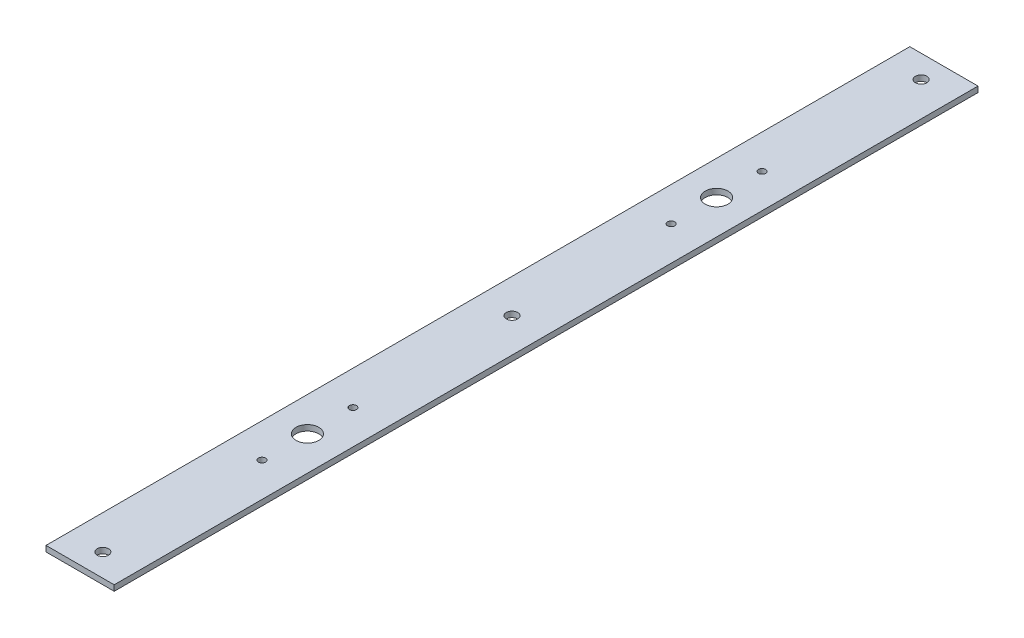
ISO-10303-21;
HEADER;
FILE_DESCRIPTION(('STEP AP214'),'2;1');
FILE_NAME('part.step','',(''),(''),'','','');
FILE_SCHEMA(('AUTOMOTIVE_DESIGN { 1 0 10303 214 1 1 1 1 }'));
ENDSEC;
DATA;
#1=APPLICATION_CONTEXT('core data for automotive mechanical design processes');
#2=APPLICATION_PROTOCOL_DEFINITION('international standard','automotive_design',2000,#1);
#3=PRODUCT_CONTEXT('',#1,'mechanical');
#4=PRODUCT('Part','Part','',(#3));
#5=PRODUCT_RELATED_PRODUCT_CATEGORY('part','',(#4));
#6=PRODUCT_DEFINITION_FORMATION('','',#4);
#7=PRODUCT_DEFINITION_CONTEXT('part definition',#1,'design');
#8=PRODUCT_DEFINITION('design','',#6,#7);
#9=PRODUCT_DEFINITION_SHAPE('','',#8);
#10=(LENGTH_UNIT() NAMED_UNIT(*) SI_UNIT(.MILLI.,.METRE.));
#11=(NAMED_UNIT(*) PLANE_ANGLE_UNIT() SI_UNIT($,.RADIAN.));
#12=(NAMED_UNIT(*) SI_UNIT($,.STERADIAN.) SOLID_ANGLE_UNIT());
#13=UNCERTAINTY_MEASURE_WITH_UNIT(LENGTH_MEASURE(1.E-05),#10,'distance_accuracy_value','');
#14=(GEOMETRIC_REPRESENTATION_CONTEXT(3) GLOBAL_UNCERTAINTY_ASSIGNED_CONTEXT((#13)) GLOBAL_UNIT_ASSIGNED_CONTEXT((#10,
#11,#12)) REPRESENTATION_CONTEXT('',''));
#15=CARTESIAN_POINT('',(0.,0.,0.));
#16=DIRECTION('',(0.,0.,1.));
#17=DIRECTION('',(1.,0.,0.));
#18=AXIS2_PLACEMENT_3D('',#15,#16,#17);
#19=CARTESIAN_POINT('',(19.05,3.175,-241.3));
#20=DIRECTION('',(-1.,0.,0.));
#21=DIRECTION('',(0.,0.,1.));
#22=AXIS2_PLACEMENT_3D('',#19,#20,#21);
#23=PLANE('',#22);
#24=DIRECTION('',(0.,0.,-1.));
#25=VECTOR('',#24,1.);
#26=CARTESIAN_POINT('',(19.05,0.,-241.3));
#27=LINE('',#26,#25);
#28=CARTESIAN_POINT('',(19.05,0.,241.3));
#29=VERTEX_POINT('',#28);
#30=CARTESIAN_POINT('',(19.05,0.,-241.3));
#31=VERTEX_POINT('',#30);
#32=EDGE_CURVE('E95',#29,#31,#27,.T.);
#33=ORIENTED_EDGE('',*,*,#32,.T.);
#34=DIRECTION('',(0.,-1.,0.));
#35=VECTOR('',#34,1.);
#36=CARTESIAN_POINT('',(19.05,3.175,-241.3));
#37=LINE('',#36,#35);
#38=CARTESIAN_POINT('',(19.05,3.175,-241.3));
#39=VERTEX_POINT('',#38);
#40=EDGE_CURVE('E11',#39,#31,#37,.T.);
#41=ORIENTED_EDGE('',*,*,#40,.F.);
#42=DIRECTION('',(0.,0.,-1.));
#43=VECTOR('',#42,1.);
#44=CARTESIAN_POINT('',(19.05,3.175,-241.3));
#45=LINE('',#44,#43);
#46=CARTESIAN_POINT('',(19.05,3.175,241.3));
#47=VERTEX_POINT('',#46);
#48=EDGE_CURVE('E83',#47,#39,#45,.T.);
#49=ORIENTED_EDGE('',*,*,#48,.F.);
#50=DIRECTION('',(0.,-1.,0.));
#51=VECTOR('',#50,1.);
#52=CARTESIAN_POINT('',(19.05,3.175,241.3));
#53=LINE('',#52,#51);
#54=EDGE_CURVE('E91',#47,#29,#53,.T.);
#55=ORIENTED_EDGE('',*,*,#54,.T.);
#56=EDGE_LOOP('',(#33,#41,#49,#55));
#57=FACE_BOUND('',#56,.T.);
#58=ADVANCED_FACE('F32',(#57),#23,.F.);
#59=CARTESIAN_POINT('',(-19.05,3.175,-241.3));
#60=DIRECTION('',(0.,0.,1.));
#61=DIRECTION('',(1.,0.,0.));
#62=AXIS2_PLACEMENT_3D('',#59,#60,#61);
#63=PLANE('',#62);
#64=DIRECTION('',(-1.,0.,0.));
#65=VECTOR('',#64,1.);
#66=CARTESIAN_POINT('',(-19.05,0.,-241.3));
#67=LINE('',#66,#65);
#68=CARTESIAN_POINT('',(-19.05,0.,-241.3));
#69=VERTEX_POINT('',#68);
#70=EDGE_CURVE('E87',#31,#69,#67,.T.);
#71=ORIENTED_EDGE('',*,*,#70,.T.);
#72=DIRECTION('',(0.,-1.,0.));
#73=VECTOR('',#72,1.);
#74=CARTESIAN_POINT('',(-19.05,3.175,-241.3));
#75=LINE('',#74,#73);
#76=CARTESIAN_POINT('',(-19.05,3.175,-241.3));
#77=VERTEX_POINT('',#76);
#78=EDGE_CURVE('E40',#77,#69,#75,.T.);
#79=ORIENTED_EDGE('',*,*,#78,.F.);
#80=DIRECTION('',(-1.,0.,0.));
#81=VECTOR('',#80,1.);
#82=CARTESIAN_POINT('',(-19.05,3.175,-241.3));
#83=LINE('',#82,#81);
#84=EDGE_CURVE('E78',#39,#77,#83,.T.);
#85=ORIENTED_EDGE('',*,*,#84,.F.);
#86=ORIENTED_EDGE('',*,*,#40,.T.);
#87=EDGE_LOOP('',(#71,#79,#85,#86));
#88=FACE_BOUND('',#87,.T.);
#89=ADVANCED_FACE('F86',(#88),#63,.F.);
#90=CARTESIAN_POINT('',(-19.05,3.175,241.3));
#91=DIRECTION('',(1.,0.,0.));
#92=DIRECTION('',(0.,0.,-1.));
#93=AXIS2_PLACEMENT_3D('',#90,#91,#92);
#94=PLANE('',#93);
#95=DIRECTION('',(0.,0.,1.));
#96=VECTOR('',#95,1.);
#97=CARTESIAN_POINT('',(-19.05,0.,241.3));
#98=LINE('',#97,#96);
#99=CARTESIAN_POINT('',(-19.05,0.,241.3));
#100=VERTEX_POINT('',#99);
#101=EDGE_CURVE('E65',#69,#100,#98,.T.);
#102=ORIENTED_EDGE('',*,*,#101,.T.);
#103=DIRECTION('',(0.,-1.,0.));
#104=VECTOR('',#103,1.);
#105=CARTESIAN_POINT('',(-19.05,3.175,241.3));
#106=LINE('',#105,#104);
#107=CARTESIAN_POINT('',(-19.05,3.175,241.3));
#108=VERTEX_POINT('',#107);
#109=EDGE_CURVE('E88',#108,#100,#106,.T.);
#110=ORIENTED_EDGE('',*,*,#109,.F.);
#111=DIRECTION('',(0.,0.,1.));
#112=VECTOR('',#111,1.);
#113=CARTESIAN_POINT('',(-19.05,3.175,241.3));
#114=LINE('',#113,#112);
#115=EDGE_CURVE('E81',#77,#108,#114,.T.);
#116=ORIENTED_EDGE('',*,*,#115,.F.);
#117=ORIENTED_EDGE('',*,*,#78,.T.);
#118=EDGE_LOOP('',(#102,#110,#116,#117));
#119=FACE_BOUND('',#118,.T.);
#120=ADVANCED_FACE('F89',(#119),#94,.F.);
#121=CARTESIAN_POINT('',(19.05,3.175,241.3));
#122=DIRECTION('',(0.,0.,-1.));
#123=DIRECTION('',(-1.,0.,0.));
#124=AXIS2_PLACEMENT_3D('',#121,#122,#123);
#125=PLANE('',#124);
#126=DIRECTION('',(1.,0.,0.));
#127=VECTOR('',#126,1.);
#128=CARTESIAN_POINT('',(19.05,0.,241.3));
#129=LINE('',#128,#127);
#130=EDGE_CURVE('E71',#100,#29,#129,.T.);
#131=ORIENTED_EDGE('',*,*,#130,.T.);
#132=ORIENTED_EDGE('',*,*,#54,.F.);
#133=DIRECTION('',(1.,0.,0.));
#134=VECTOR('',#133,1.);
#135=CARTESIAN_POINT('',(19.05,3.175,241.3));
#136=LINE('',#135,#134);
#137=EDGE_CURVE('E48',#108,#47,#136,.T.);
#138=ORIENTED_EDGE('',*,*,#137,.F.);
#139=ORIENTED_EDGE('',*,*,#109,.T.);
#140=EDGE_LOOP('',(#131,#132,#138,#139));
#141=FACE_BOUND('',#140,.T.);
#142=ADVANCED_FACE('F103',(#141),#125,.F.);
#143=CARTESIAN_POINT('',(0.,3.175,0.));
#144=DIRECTION('',(0.,-1.,0.));
#145=DIRECTION('',(0.,0.,-1.));
#146=AXIS2_PLACEMENT_3D('',#143,#144,#145);
#147=PLANE('',#146);
#148=CARTESIAN_POINT('',(0.,3.175,88.9));
#149=DIRECTION('',(0.,1.,0.));
#150=DIRECTION('',(0.,0.,1.));
#151=AXIS2_PLACEMENT_3D('',#148,#149,#150);
#152=CIRCLE('',#151,1.98437500000001);
#153=CARTESIAN_POINT('',(0.,3.175,90.884375));
#154=VERTEX_POINT('',#153);
#155=EDGE_CURVE('E159',#154,#154,#152,.T.);
#156=ORIENTED_EDGE('',*,*,#155,.F.);
#157=EDGE_LOOP('',(#156));
#158=FACE_BOUND('',#157,.T.);
#159=CARTESIAN_POINT('',(0.,3.175,139.7));
#160=DIRECTION('',(0.,1.,0.));
#161=DIRECTION('',(0.,0.,1.));
#162=AXIS2_PLACEMENT_3D('',#159,#160,#161);
#163=CIRCLE('',#162,1.98437500000001);
#164=CARTESIAN_POINT('',(0.,3.175,141.684375));
#165=VERTEX_POINT('',#164);
#166=EDGE_CURVE('E153',#165,#165,#163,.T.);
#167=ORIENTED_EDGE('',*,*,#166,.F.);
#168=EDGE_LOOP('',(#167));
#169=FACE_BOUND('',#168,.T.);
#170=CARTESIAN_POINT('',(0.,3.175,-88.9));
#171=DIRECTION('',(0.,1.,0.));
#172=DIRECTION('',(0.,0.,1.));
#173=AXIS2_PLACEMENT_3D('',#170,#171,#172);
#174=CIRCLE('',#173,1.98437500000001);
#175=CARTESIAN_POINT('',(0.,3.175,-86.915625));
#176=VERTEX_POINT('',#175);
#177=EDGE_CURVE('E147',#176,#176,#174,.T.);
#178=ORIENTED_EDGE('',*,*,#177,.F.);
#179=EDGE_LOOP('',(#178));
#180=FACE_BOUND('',#179,.T.);
#181=CARTESIAN_POINT('',(0.,3.175,-139.7));
#182=DIRECTION('',(0.,1.,0.));
#183=DIRECTION('',(0.,0.,1.));
#184=AXIS2_PLACEMENT_3D('',#181,#182,#183);
#185=CIRCLE('',#184,1.98437500000001);
#186=CARTESIAN_POINT('',(0.,3.175,-137.715625));
#187=VERTEX_POINT('',#186);
#188=EDGE_CURVE('E141',#187,#187,#185,.T.);
#189=ORIENTED_EDGE('',*,*,#188,.F.);
#190=EDGE_LOOP('',(#189));
#191=FACE_BOUND('',#190,.T.);
#192=CARTESIAN_POINT('',(0.,3.175,-114.3));
#193=DIRECTION('',(0.,1.,0.));
#194=DIRECTION('',(0.,0.,1.));
#195=AXIS2_PLACEMENT_3D('',#192,#193,#194);
#196=CIRCLE('',#195,6.35000000000001);
#197=CARTESIAN_POINT('',(0.,3.175,-107.95));
#198=VERTEX_POINT('',#197);
#199=EDGE_CURVE('E135',#198,#198,#196,.T.);
#200=ORIENTED_EDGE('',*,*,#199,.F.);
#201=EDGE_LOOP('',(#200));
#202=FACE_BOUND('',#201,.T.);
#203=CARTESIAN_POINT('',(0.,3.175,114.3));
#204=DIRECTION('',(0.,1.,0.));
#205=DIRECTION('',(0.,0.,1.));
#206=AXIS2_PLACEMENT_3D('',#203,#204,#205);
#207=CIRCLE('',#206,6.35000000000001);
#208=CARTESIAN_POINT('',(0.,3.175,120.65));
#209=VERTEX_POINT('',#208);
#210=EDGE_CURVE('E129',#209,#209,#207,.T.);
#211=ORIENTED_EDGE('',*,*,#210,.F.);
#212=EDGE_LOOP('',(#211));
#213=FACE_BOUND('',#212,.T.);
#214=CARTESIAN_POINT('',(0.,3.175,228.6));
#215=DIRECTION('',(0.,1.,0.));
#216=DIRECTION('',(0.,0.,1.));
#217=AXIS2_PLACEMENT_3D('',#214,#215,#216);
#218=CIRCLE('',#217,3.17500000000001);
#219=CARTESIAN_POINT('',(0.,3.175,231.775));
#220=VERTEX_POINT('',#219);
#221=EDGE_CURVE('E123',#220,#220,#218,.T.);
#222=ORIENTED_EDGE('',*,*,#221,.F.);
#223=EDGE_LOOP('',(#222));
#224=FACE_BOUND('',#223,.T.);
#225=CARTESIAN_POINT('',(0.,3.175,-228.6));
#226=DIRECTION('',(0.,1.,0.));
#227=DIRECTION('',(0.,0.,1.));
#228=AXIS2_PLACEMENT_3D('',#225,#226,#227);
#229=CIRCLE('',#228,3.17500000000001);
#230=CARTESIAN_POINT('',(0.,3.175,-225.425));
#231=VERTEX_POINT('',#230);
#232=EDGE_CURVE('E117',#231,#231,#229,.T.);
#233=ORIENTED_EDGE('',*,*,#232,.F.);
#234=EDGE_LOOP('',(#233));
#235=FACE_BOUND('',#234,.T.);
#236=CARTESIAN_POINT('',(0.,3.175,0.));
#237=DIRECTION('',(0.,1.,0.));
#238=DIRECTION('',(0.,0.,1.));
#239=AXIS2_PLACEMENT_3D('',#236,#237,#238);
#240=CIRCLE('',#239,3.17500000000001);
#241=CARTESIAN_POINT('',(0.,3.175,3.17500000000001));
#242=VERTEX_POINT('',#241);
#243=EDGE_CURVE('E111',#242,#242,#240,.T.);
#244=ORIENTED_EDGE('',*,*,#243,.F.);
#245=EDGE_LOOP('',(#244));
#246=FACE_BOUND('',#245,.T.);
#247=ORIENTED_EDGE('',*,*,#48,.T.);
#248=ORIENTED_EDGE('',*,*,#84,.T.);
#249=ORIENTED_EDGE('',*,*,#115,.T.);
#250=ORIENTED_EDGE('',*,*,#137,.T.);
#251=EDGE_LOOP('',(#247,#248,#249,#250));
#252=FACE_BOUND('',#251,.T.);
#253=ADVANCED_FACE('F79',(#158,#169,#180,#191,#202,#213,#224,#235,#246,#252),#147,.F.);
#254=CARTESIAN_POINT('',(0.,0.,0.));
#255=DIRECTION('',(0.,-1.,0.));
#256=DIRECTION('',(0.,0.,-1.));
#257=AXIS2_PLACEMENT_3D('',#254,#255,#256);
#258=PLANE('',#257);
#259=CARTESIAN_POINT('',(0.,0.,88.9));
#260=DIRECTION('',(0.,1.,0.));
#261=DIRECTION('',(0.,0.,1.));
#262=AXIS2_PLACEMENT_3D('',#259,#260,#261);
#263=CIRCLE('',#262,1.98437500000001);
#264=CARTESIAN_POINT('',(0.,0.,90.884375));
#265=VERTEX_POINT('',#264);
#266=EDGE_CURVE('E156',#265,#265,#263,.T.);
#267=ORIENTED_EDGE('',*,*,#266,.T.);
#268=EDGE_LOOP('',(#267));
#269=FACE_BOUND('',#268,.T.);
#270=CARTESIAN_POINT('',(0.,0.,139.7));
#271=DIRECTION('',(0.,1.,0.));
#272=DIRECTION('',(0.,0.,1.));
#273=AXIS2_PLACEMENT_3D('',#270,#271,#272);
#274=CIRCLE('',#273,1.98437500000001);
#275=CARTESIAN_POINT('',(0.,0.,141.684375));
#276=VERTEX_POINT('',#275);
#277=EDGE_CURVE('E150',#276,#276,#274,.T.);
#278=ORIENTED_EDGE('',*,*,#277,.T.);
#279=EDGE_LOOP('',(#278));
#280=FACE_BOUND('',#279,.T.);
#281=CARTESIAN_POINT('',(0.,0.,-88.9));
#282=DIRECTION('',(0.,1.,0.));
#283=DIRECTION('',(0.,0.,1.));
#284=AXIS2_PLACEMENT_3D('',#281,#282,#283);
#285=CIRCLE('',#284,1.98437500000001);
#286=CARTESIAN_POINT('',(0.,0.,-86.915625));
#287=VERTEX_POINT('',#286);
#288=EDGE_CURVE('E144',#287,#287,#285,.T.);
#289=ORIENTED_EDGE('',*,*,#288,.T.);
#290=EDGE_LOOP('',(#289));
#291=FACE_BOUND('',#290,.T.);
#292=CARTESIAN_POINT('',(0.,0.,-139.7));
#293=DIRECTION('',(0.,1.,0.));
#294=DIRECTION('',(0.,0.,1.));
#295=AXIS2_PLACEMENT_3D('',#292,#293,#294);
#296=CIRCLE('',#295,1.98437500000001);
#297=CARTESIAN_POINT('',(0.,0.,-137.715625));
#298=VERTEX_POINT('',#297);
#299=EDGE_CURVE('E138',#298,#298,#296,.T.);
#300=ORIENTED_EDGE('',*,*,#299,.T.);
#301=EDGE_LOOP('',(#300));
#302=FACE_BOUND('',#301,.T.);
#303=CARTESIAN_POINT('',(0.,0.,-114.3));
#304=DIRECTION('',(0.,1.,0.));
#305=DIRECTION('',(0.,0.,1.));
#306=AXIS2_PLACEMENT_3D('',#303,#304,#305);
#307=CIRCLE('',#306,6.35000000000001);
#308=CARTESIAN_POINT('',(0.,0.,-107.95));
#309=VERTEX_POINT('',#308);
#310=EDGE_CURVE('E132',#309,#309,#307,.T.);
#311=ORIENTED_EDGE('',*,*,#310,.T.);
#312=EDGE_LOOP('',(#311));
#313=FACE_BOUND('',#312,.T.);
#314=CARTESIAN_POINT('',(0.,0.,114.3));
#315=DIRECTION('',(0.,1.,0.));
#316=DIRECTION('',(0.,0.,1.));
#317=AXIS2_PLACEMENT_3D('',#314,#315,#316);
#318=CIRCLE('',#317,6.35000000000001);
#319=CARTESIAN_POINT('',(0.,0.,120.65));
#320=VERTEX_POINT('',#319);
#321=EDGE_CURVE('E126',#320,#320,#318,.T.);
#322=ORIENTED_EDGE('',*,*,#321,.T.);
#323=EDGE_LOOP('',(#322));
#324=FACE_BOUND('',#323,.T.);
#325=CARTESIAN_POINT('',(0.,0.,228.6));
#326=DIRECTION('',(0.,1.,0.));
#327=DIRECTION('',(0.,0.,1.));
#328=AXIS2_PLACEMENT_3D('',#325,#326,#327);
#329=CIRCLE('',#328,3.17500000000001);
#330=CARTESIAN_POINT('',(0.,0.,231.775));
#331=VERTEX_POINT('',#330);
#332=EDGE_CURVE('E120',#331,#331,#329,.T.);
#333=ORIENTED_EDGE('',*,*,#332,.T.);
#334=EDGE_LOOP('',(#333));
#335=FACE_BOUND('',#334,.T.);
#336=CARTESIAN_POINT('',(0.,0.,-228.6));
#337=DIRECTION('',(0.,1.,0.));
#338=DIRECTION('',(0.,0.,1.));
#339=AXIS2_PLACEMENT_3D('',#336,#337,#338);
#340=CIRCLE('',#339,3.17500000000001);
#341=CARTESIAN_POINT('',(0.,0.,-225.425));
#342=VERTEX_POINT('',#341);
#343=EDGE_CURVE('E114',#342,#342,#340,.T.);
#344=ORIENTED_EDGE('',*,*,#343,.T.);
#345=EDGE_LOOP('',(#344));
#346=FACE_BOUND('',#345,.T.);
#347=CARTESIAN_POINT('',(0.,0.,0.));
#348=DIRECTION('',(0.,1.,0.));
#349=DIRECTION('',(0.,0.,1.));
#350=AXIS2_PLACEMENT_3D('',#347,#348,#349);
#351=CIRCLE('',#350,3.17500000000001);
#352=CARTESIAN_POINT('',(0.,0.,3.17500000000001));
#353=VERTEX_POINT('',#352);
#354=EDGE_CURVE('E98',#353,#353,#351,.T.);
#355=ORIENTED_EDGE('',*,*,#354,.T.);
#356=EDGE_LOOP('',(#355));
#357=FACE_BOUND('',#356,.T.);
#358=ORIENTED_EDGE('',*,*,#32,.F.);
#359=ORIENTED_EDGE('',*,*,#130,.F.);
#360=ORIENTED_EDGE('',*,*,#101,.F.);
#361=ORIENTED_EDGE('',*,*,#70,.F.);
#362=EDGE_LOOP('',(#358,#359,#360,#361));
#363=FACE_BOUND('',#362,.T.);
#364=ADVANCED_FACE('F106',(#269,#280,#291,#302,#313,#324,#335,#346,#357,#363),#258,.T.);
#365=CARTESIAN_POINT('',(0.,3.175,0.));
#366=DIRECTION('',(0.,1.,0.));
#367=DIRECTION('',(0.,0.,1.));
#368=AXIS2_PLACEMENT_3D('',#365,#366,#367);
#369=CYLINDRICAL_SURFACE('',#368,3.17500000000001);
#370=ORIENTED_EDGE('',*,*,#354,.F.);
#371=EDGE_LOOP('',(#370));
#372=FACE_BOUND('',#371,.T.);
#373=ORIENTED_EDGE('',*,*,#243,.T.);
#374=EDGE_LOOP('',(#373));
#375=FACE_BOUND('',#374,.T.);
#376=ADVANCED_FACE('F184',(#372,#375),#369,.F.);
#377=CARTESIAN_POINT('',(0.,3.175,-228.6));
#378=DIRECTION('',(0.,1.,0.));
#379=DIRECTION('',(0.,0.,1.));
#380=AXIS2_PLACEMENT_3D('',#377,#378,#379);
#381=CYLINDRICAL_SURFACE('',#380,3.17500000000001);
#382=ORIENTED_EDGE('',*,*,#343,.F.);
#383=EDGE_LOOP('',(#382));
#384=FACE_BOUND('',#383,.T.);
#385=ORIENTED_EDGE('',*,*,#232,.T.);
#386=EDGE_LOOP('',(#385));
#387=FACE_BOUND('',#386,.T.);
#388=ADVANCED_FACE('F186',(#384,#387),#381,.F.);
#389=CARTESIAN_POINT('',(0.,3.175,228.6));
#390=DIRECTION('',(0.,1.,0.));
#391=DIRECTION('',(0.,0.,1.));
#392=AXIS2_PLACEMENT_3D('',#389,#390,#391);
#393=CYLINDRICAL_SURFACE('',#392,3.17500000000001);
#394=ORIENTED_EDGE('',*,*,#332,.F.);
#395=EDGE_LOOP('',(#394));
#396=FACE_BOUND('',#395,.T.);
#397=ORIENTED_EDGE('',*,*,#221,.T.);
#398=EDGE_LOOP('',(#397));
#399=FACE_BOUND('',#398,.T.);
#400=ADVANCED_FACE('F193',(#396,#399),#393,.F.);
#401=CARTESIAN_POINT('',(0.,3.175,114.3));
#402=DIRECTION('',(0.,1.,0.));
#403=DIRECTION('',(0.,0.,1.));
#404=AXIS2_PLACEMENT_3D('',#401,#402,#403);
#405=CYLINDRICAL_SURFACE('',#404,6.35000000000001);
#406=ORIENTED_EDGE('',*,*,#321,.F.);
#407=EDGE_LOOP('',(#406));
#408=FACE_BOUND('',#407,.T.);
#409=ORIENTED_EDGE('',*,*,#210,.T.);
#410=EDGE_LOOP('',(#409));
#411=FACE_BOUND('',#410,.T.);
#412=ADVANCED_FACE('F273',(#408,#411),#405,.F.);
#413=CARTESIAN_POINT('',(0.,3.175,-114.3));
#414=DIRECTION('',(0.,1.,0.));
#415=DIRECTION('',(0.,0.,1.));
#416=AXIS2_PLACEMENT_3D('',#413,#414,#415);
#417=CYLINDRICAL_SURFACE('',#416,6.35000000000001);
#418=ORIENTED_EDGE('',*,*,#310,.F.);
#419=EDGE_LOOP('',(#418));
#420=FACE_BOUND('',#419,.T.);
#421=ORIENTED_EDGE('',*,*,#199,.T.);
#422=EDGE_LOOP('',(#421));
#423=FACE_BOUND('',#422,.T.);
#424=ADVANCED_FACE('F235',(#420,#423),#417,.F.);
#425=CARTESIAN_POINT('',(0.,3.175,-139.7));
#426=DIRECTION('',(0.,1.,0.));
#427=DIRECTION('',(0.,0.,1.));
#428=AXIS2_PLACEMENT_3D('',#425,#426,#427);
#429=CYLINDRICAL_SURFACE('',#428,1.98437500000001);
#430=ORIENTED_EDGE('',*,*,#299,.F.);
#431=EDGE_LOOP('',(#430));
#432=FACE_BOUND('',#431,.T.);
#433=ORIENTED_EDGE('',*,*,#188,.T.);
#434=EDGE_LOOP('',(#433));
#435=FACE_BOUND('',#434,.T.);
#436=ADVANCED_FACE('F229',(#432,#435),#429,.F.);
#437=CARTESIAN_POINT('',(0.,3.175,-88.9));
#438=DIRECTION('',(0.,1.,0.));
#439=DIRECTION('',(0.,0.,1.));
#440=AXIS2_PLACEMENT_3D('',#437,#438,#439);
#441=CYLINDRICAL_SURFACE('',#440,1.98437500000001);
#442=ORIENTED_EDGE('',*,*,#288,.F.);
#443=EDGE_LOOP('',(#442));
#444=FACE_BOUND('',#443,.T.);
#445=ORIENTED_EDGE('',*,*,#177,.T.);
#446=EDGE_LOOP('',(#445));
#447=FACE_BOUND('',#446,.T.);
#448=ADVANCED_FACE('F234',(#444,#447),#441,.F.);
#449=CARTESIAN_POINT('',(0.,3.175,139.7));
#450=DIRECTION('',(0.,1.,0.));
#451=DIRECTION('',(0.,0.,1.));
#452=AXIS2_PLACEMENT_3D('',#449,#450,#451);
#453=CYLINDRICAL_SURFACE('',#452,1.98437500000001);
#454=ORIENTED_EDGE('',*,*,#277,.F.);
#455=EDGE_LOOP('',(#454));
#456=FACE_BOUND('',#455,.T.);
#457=ORIENTED_EDGE('',*,*,#166,.T.);
#458=EDGE_LOOP('',(#457));
#459=FACE_BOUND('',#458,.T.);
#460=ADVANCED_FACE('F247',(#456,#459),#453,.F.);
#461=CARTESIAN_POINT('',(0.,3.175,88.9));
#462=DIRECTION('',(0.,1.,0.));
#463=DIRECTION('',(0.,0.,1.));
#464=AXIS2_PLACEMENT_3D('',#461,#462,#463);
#465=CYLINDRICAL_SURFACE('',#464,1.98437500000001);
#466=ORIENTED_EDGE('',*,*,#266,.F.);
#467=EDGE_LOOP('',(#466));
#468=FACE_BOUND('',#467,.T.);
#469=ORIENTED_EDGE('',*,*,#155,.T.);
#470=EDGE_LOOP('',(#469));
#471=FACE_BOUND('',#470,.T.);
#472=ADVANCED_FACE('F163',(#468,#471),#465,.F.);
#473=CLOSED_SHELL('',(#58,#89,#120,#142,#253,#364,#376,#388,#400,#412,#424,#436,#448,#460,#472));
#474=MANIFOLD_SOLID_BREP('B2',#473);
#475=ADVANCED_BREP_SHAPE_REPRESENTATION('',(#18,#474),#14);
#476=SHAPE_DEFINITION_REPRESENTATION(#9,#475);
ENDSEC;
END-ISO-10303-21;
